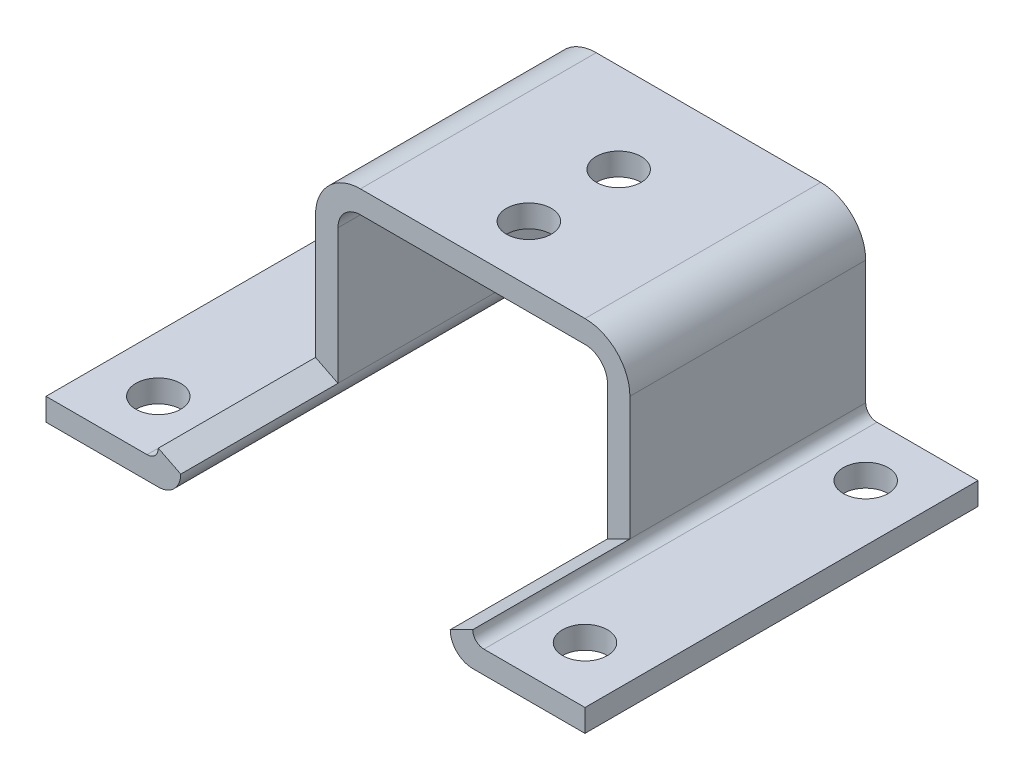
ISO-10303-21;
HEADER;
FILE_DESCRIPTION(('STEP AP214'),'2;1');
FILE_NAME('part.step','',(''),(''),'','','');
FILE_SCHEMA(('AUTOMOTIVE_DESIGN { 1 0 10303 214 1 1 1 1 }'));
ENDSEC;
DATA;
#1=APPLICATION_CONTEXT('core data for automotive mechanical design processes');
#2=APPLICATION_PROTOCOL_DEFINITION('international standard','automotive_design',2000,#1);
#3=PRODUCT_CONTEXT('',#1,'mechanical');
#4=PRODUCT('Part','Part','',(#3));
#5=PRODUCT_RELATED_PRODUCT_CATEGORY('part','',(#4));
#6=PRODUCT_DEFINITION_FORMATION('','',#4);
#7=PRODUCT_DEFINITION_CONTEXT('part definition',#1,'design');
#8=PRODUCT_DEFINITION('design','',#6,#7);
#9=PRODUCT_DEFINITION_SHAPE('','',#8);
#10=(LENGTH_UNIT() NAMED_UNIT(*) SI_UNIT(.MILLI.,.METRE.));
#11=(NAMED_UNIT(*) PLANE_ANGLE_UNIT() SI_UNIT($,.RADIAN.));
#12=(NAMED_UNIT(*) SI_UNIT($,.STERADIAN.) SOLID_ANGLE_UNIT());
#13=UNCERTAINTY_MEASURE_WITH_UNIT(LENGTH_MEASURE(1.E-05),#10,'distance_accuracy_value','');
#14=(GEOMETRIC_REPRESENTATION_CONTEXT(3) GLOBAL_UNCERTAINTY_ASSIGNED_CONTEXT((#13)) GLOBAL_UNIT_ASSIGNED_CONTEXT((#10,
#11,#12)) REPRESENTATION_CONTEXT('',''));
#15=CARTESIAN_POINT('',(0.,0.,0.));
#16=DIRECTION('',(0.,0.,1.));
#17=DIRECTION('',(1.,0.,0.));
#18=AXIS2_PLACEMENT_3D('',#15,#16,#17);
#19=CARTESIAN_POINT('',(-14.,2.,21.));
#20=DIRECTION('',(0.,0.,1.));
#21=DIRECTION('',(1.,0.,0.));
#22=AXIS2_PLACEMENT_3D('',#19,#20,#21);
#23=PLANE('',#22);
#24=DIRECTION('',(0.,-1.,0.));
#25=VECTOR('',#24,1.);
#26=CARTESIAN_POINT('',(12.,2.00000000000002,21.));
#27=LINE('',#26,#25);
#28=CARTESIAN_POINT('',(12.,14.,21.));
#29=VERTEX_POINT('',#28);
#30=CARTESIAN_POINT('',(12.,2.00000000000002,21.));
#31=VERTEX_POINT('',#30);
#32=EDGE_CURVE('E353',#29,#31,#27,.T.);
#33=ORIENTED_EDGE('',*,*,#32,.T.);
#34=DIRECTION('',(-0.894427190999918,-0.447213595499953,0.));
#35=VECTOR('',#34,1.);
#36=CARTESIAN_POINT('',(12.,2.00000000000002,21.));
#37=LINE('',#36,#35);
#38=CARTESIAN_POINT('',(14.,3.00000000000001,21.));
#39=VERTEX_POINT('',#38);
#40=EDGE_CURVE('E303',#39,#31,#37,.T.);
#41=ORIENTED_EDGE('',*,*,#40,.F.);
#42=DIRECTION('',(0.,1.,0.));
#43=VECTOR('',#42,1.);
#44=CARTESIAN_POINT('',(14.,3.00000000000001,21.));
#45=LINE('',#44,#43);
#46=CARTESIAN_POINT('',(14.,14.,21.));
#47=VERTEX_POINT('',#46);
#48=EDGE_CURVE('E167',#39,#47,#45,.T.);
#49=ORIENTED_EDGE('',*,*,#48,.T.);
#50=CARTESIAN_POINT('',(10.,14.,21.));
#51=DIRECTION('',(0.,0.,1.));
#52=DIRECTION('',(1.,0.,0.));
#53=AXIS2_PLACEMENT_3D('',#50,#51,#52);
#54=CIRCLE('',#53,4.);
#55=CARTESIAN_POINT('',(9.99999999999996,18.,21.));
#56=VERTEX_POINT('',#55);
#57=EDGE_CURVE('E159',#47,#56,#54,.T.);
#58=ORIENTED_EDGE('',*,*,#57,.T.);
#59=DIRECTION('',(-1.,0.,0.));
#60=VECTOR('',#59,1.);
#61=CARTESIAN_POINT('',(9.99999999999996,18.,21.));
#62=LINE('',#61,#60);
#63=CARTESIAN_POINT('',(-9.99999999999997,18.,21.));
#64=VERTEX_POINT('',#63);
#65=EDGE_CURVE('E163',#56,#64,#62,.T.);
#66=ORIENTED_EDGE('',*,*,#65,.T.);
#67=CARTESIAN_POINT('',(-10.,14.,21.));
#68=DIRECTION('',(0.,0.,1.));
#69=DIRECTION('',(-1.,0.,0.));
#70=AXIS2_PLACEMENT_3D('',#67,#68,#69);
#71=CIRCLE('',#70,4.);
#72=CARTESIAN_POINT('',(-14.,14.,21.));
#73=VERTEX_POINT('',#72);
#74=EDGE_CURVE('E56',#64,#73,#71,.T.);
#75=ORIENTED_EDGE('',*,*,#74,.T.);
#76=DIRECTION('',(0.,-1.,0.));
#77=VECTOR('',#76,1.);
#78=CARTESIAN_POINT('',(-14.,3.00000000000001,21.));
#79=LINE('',#78,#77);
#80=CARTESIAN_POINT('',(-14.,3.00000000000001,21.));
#81=VERTEX_POINT('',#80);
#82=EDGE_CURVE('E185',#73,#81,#79,.T.);
#83=ORIENTED_EDGE('',*,*,#82,.T.);
#84=DIRECTION('',(-0.894427190999916,0.447213595499958,0.));
#85=VECTOR('',#84,1.);
#86=CARTESIAN_POINT('',(-14.,3.00000000000001,21.));
#87=LINE('',#86,#85);
#88=CARTESIAN_POINT('',(-12.,2.,21.));
#89=VERTEX_POINT('',#88);
#90=EDGE_CURVE('E136',#89,#81,#87,.T.);
#91=ORIENTED_EDGE('',*,*,#90,.F.);
#92=DIRECTION('',(0.,1.,0.));
#93=VECTOR('',#92,1.);
#94=CARTESIAN_POINT('',(-12.,2.00000000000001,21.));
#95=LINE('',#94,#93);
#96=CARTESIAN_POINT('',(-12.,14.,21.));
#97=VERTEX_POINT('',#96);
#98=EDGE_CURVE('E231',#89,#97,#95,.T.);
#99=ORIENTED_EDGE('',*,*,#98,.T.);
#100=CARTESIAN_POINT('',(-10.,14.,21.));
#101=DIRECTION('',(0.,0.,-1.));
#102=DIRECTION('',(-1.,0.,0.));
#103=AXIS2_PLACEMENT_3D('',#100,#101,#102);
#104=CIRCLE('',#103,2.);
#105=CARTESIAN_POINT('',(-9.99999999999998,16.,21.));
#106=VERTEX_POINT('',#105);
#107=EDGE_CURVE('E347',#97,#106,#104,.T.);
#108=ORIENTED_EDGE('',*,*,#107,.T.);
#109=DIRECTION('',(1.,0.,0.));
#110=VECTOR('',#109,1.);
#111=CARTESIAN_POINT('',(-9.99999999999998,16.,21.));
#112=LINE('',#111,#110);
#113=CARTESIAN_POINT('',(9.99999999999998,16.,21.));
#114=VERTEX_POINT('',#113);
#115=EDGE_CURVE('E349',#106,#114,#112,.T.);
#116=ORIENTED_EDGE('',*,*,#115,.T.);
#117=CARTESIAN_POINT('',(10.,14.,21.));
#118=DIRECTION('',(0.,0.,-1.));
#119=DIRECTION('',(1.,0.,0.));
#120=AXIS2_PLACEMENT_3D('',#117,#118,#119);
#121=CIRCLE('',#120,2.);
#122=EDGE_CURVE('E351',#114,#29,#121,.T.);
#123=ORIENTED_EDGE('',*,*,#122,.T.);
#124=EDGE_LOOP('',(#33,#41,#49,#58,#66,#75,#83,#91,#99,#108,#116,#123));
#125=FACE_BOUND('',#124,.T.);
#126=ADVANCED_FACE('F37',(#125),#23,.T.);
#127=CARTESIAN_POINT('',(-24.,2.,21.));
#128=DIRECTION('',(1.,0.,0.));
#129=DIRECTION('',(0.,0.,-1.));
#130=AXIS2_PLACEMENT_3D('',#127,#128,#129);
#131=PLANE('',#130);
#132=DIRECTION('',(0.,-1.,0.));
#133=VECTOR('',#132,1.);
#134=CARTESIAN_POINT('',(-24.,2.,0.));
#135=LINE('',#134,#133);
#136=CARTESIAN_POINT('',(-24.,2.,0.));
#137=VERTEX_POINT('',#136);
#138=CARTESIAN_POINT('',(-24.,0.,0.));
#139=VERTEX_POINT('',#138);
#140=EDGE_CURVE('E191',#137,#139,#135,.T.);
#141=ORIENTED_EDGE('',*,*,#140,.T.);
#142=DIRECTION('',(0.,0.,-1.));
#143=VECTOR('',#142,1.);
#144=CARTESIAN_POINT('',(-24.,0.,21.));
#145=LINE('',#144,#143);
#146=CARTESIAN_POINT('',(-24.,0.,35.));
#147=VERTEX_POINT('',#146);
#148=EDGE_CURVE('E11',#147,#139,#145,.T.);
#149=ORIENTED_EDGE('',*,*,#148,.F.);
#150=DIRECTION('',(0.,-1.,0.));
#151=VECTOR('',#150,1.);
#152=CARTESIAN_POINT('',(-24.,2.,35.));
#153=LINE('',#152,#151);
#154=CARTESIAN_POINT('',(-24.,2.,35.));
#155=VERTEX_POINT('',#154);
#156=EDGE_CURVE('E325',#155,#147,#153,.T.);
#157=ORIENTED_EDGE('',*,*,#156,.F.);
#158=DIRECTION('',(0.,0.,-1.));
#159=VECTOR('',#158,1.);
#160=CARTESIAN_POINT('',(-24.,2.,21.));
#161=LINE('',#160,#159);
#162=EDGE_CURVE('E190',#155,#137,#161,.T.);
#163=ORIENTED_EDGE('',*,*,#162,.T.);
#164=EDGE_LOOP('',(#141,#149,#157,#163));
#165=FACE_BOUND('',#164,.T.);
#166=ADVANCED_FACE('F39',(#165),#131,.F.);
#167=CARTESIAN_POINT('',(-24.,0.,21.));
#168=DIRECTION('',(0.,1.,0.));
#169=DIRECTION('',(0.,0.,1.));
#170=AXIS2_PLACEMENT_3D('',#167,#168,#169);
#171=PLANE('',#170);
#172=CARTESIAN_POINT('',(-19.,0.,30.));
#173=DIRECTION('',(0.,1.,0.));
#174=DIRECTION('',(0.,0.,1.));
#175=AXIS2_PLACEMENT_3D('',#172,#173,#174);
#176=CIRCLE('',#175,2.);
#177=CARTESIAN_POINT('',(-19.,0.,32.));
#178=VERTEX_POINT('',#177);
#179=EDGE_CURVE('E854',#178,#178,#176,.T.);
#180=ORIENTED_EDGE('',*,*,#179,.T.);
#181=EDGE_LOOP('',(#180));
#182=FACE_BOUND('',#181,.T.);
#183=CARTESIAN_POINT('',(-19.,0.,5.));
#184=DIRECTION('',(0.,1.,0.));
#185=DIRECTION('',(0.,0.,1.));
#186=AXIS2_PLACEMENT_3D('',#183,#184,#185);
#187=CIRCLE('',#186,2.);
#188=CARTESIAN_POINT('',(-19.,0.,7.));
#189=VERTEX_POINT('',#188);
#190=EDGE_CURVE('E281',#189,#189,#187,.T.);
#191=ORIENTED_EDGE('',*,*,#190,.T.);
#192=EDGE_LOOP('',(#191));
#193=FACE_BOUND('',#192,.T.);
#194=DIRECTION('',(1.,0.,0.));
#195=VECTOR('',#194,1.);
#196=CARTESIAN_POINT('',(-24.,0.,0.));
#197=LINE('',#196,#195);
#198=CARTESIAN_POINT('',(-14.,0.,0.));
#199=VERTEX_POINT('',#198);
#200=EDGE_CURVE('E194',#139,#199,#197,.T.);
#201=ORIENTED_EDGE('',*,*,#200,.T.);
#202=DIRECTION('',(0.,0.,-1.));
#203=VECTOR('',#202,1.);
#204=CARTESIAN_POINT('',(-14.,0.,21.));
#205=LINE('',#204,#203);
#206=CARTESIAN_POINT('',(-14.,0.,35.));
#207=VERTEX_POINT('',#206);
#208=EDGE_CURVE('E47',#207,#199,#205,.T.);
#209=ORIENTED_EDGE('',*,*,#208,.F.);
#210=DIRECTION('',(1.,0.,0.));
#211=VECTOR('',#210,1.);
#212=CARTESIAN_POINT('',(-24.,0.,35.));
#213=LINE('',#212,#211);
#214=EDGE_CURVE('E328',#147,#207,#213,.T.);
#215=ORIENTED_EDGE('',*,*,#214,.F.);
#216=ORIENTED_EDGE('',*,*,#148,.T.);
#217=EDGE_LOOP('',(#201,#209,#215,#216));
#218=FACE_BOUND('',#217,.T.);
#219=ADVANCED_FACE('F436',(#182,#193,#218),#171,.F.);
#220=CARTESIAN_POINT('',(-14.,2.,21.));
#221=DIRECTION('',(0.,0.,-1.));
#222=DIRECTION('',(-1.,0.,0.));
#223=AXIS2_PLACEMENT_3D('',#220,#221,#222);
#224=CYLINDRICAL_SURFACE('',#223,2.);
#225=CARTESIAN_POINT('',(-14.,2.,0.));
#226=DIRECTION('',(0.,0.,1.));
#227=DIRECTION('',(1.,0.,0.));
#228=AXIS2_PLACEMENT_3D('',#225,#226,#227);
#229=CIRCLE('',#228,2.);
#230=CARTESIAN_POINT('',(-12.,2.,0.));
#231=VERTEX_POINT('',#230);
#232=EDGE_CURVE('E197',#199,#231,#229,.T.);
#233=ORIENTED_EDGE('',*,*,#232,.T.);
#234=DIRECTION('',(0.,0.,-1.));
#235=VECTOR('',#234,1.);
#236=CARTESIAN_POINT('',(-12.,2.,21.));
#237=LINE('',#236,#235);
#238=EDGE_CURVE('E272',#89,#231,#237,.T.);
#239=ORIENTED_EDGE('',*,*,#238,.F.);
#240=DIRECTION('',(0.,0.,-1.));
#241=VECTOR('',#240,1.);
#242=CARTESIAN_POINT('',(-12.,2.,35.));
#243=LINE('',#242,#241);
#244=CARTESIAN_POINT('',(-12.,2.,35.));
#245=VERTEX_POINT('',#244);
#246=EDGE_CURVE('E195',#245,#89,#243,.T.);
#247=ORIENTED_EDGE('',*,*,#246,.F.);
#248=CARTESIAN_POINT('',(-14.,2.,35.));
#249=DIRECTION('',(0.,0.,1.));
#250=DIRECTION('',(1.,0.,0.));
#251=AXIS2_PLACEMENT_3D('',#248,#249,#250);
#252=CIRCLE('',#251,2.);
#253=EDGE_CURVE('E331',#207,#245,#252,.T.);
#254=ORIENTED_EDGE('',*,*,#253,.F.);
#255=ORIENTED_EDGE('',*,*,#208,.T.);
#256=EDGE_LOOP('',(#233,#239,#247,#254,#255));
#257=FACE_BOUND('',#256,.T.);
#258=ADVANCED_FACE('F439',(#257),#224,.T.);
#259=CARTESIAN_POINT('',(-12.,2.00000000000001,21.));
#260=DIRECTION('',(-1.,0.,0.));
#261=DIRECTION('',(0.,0.,1.));
#262=AXIS2_PLACEMENT_3D('',#259,#260,#261);
#263=PLANE('',#262);
#264=DIRECTION('',(0.,1.,0.));
#265=VECTOR('',#264,1.);
#266=CARTESIAN_POINT('',(-12.,2.00000000000001,0.));
#267=LINE('',#266,#265);
#268=CARTESIAN_POINT('',(-12.,14.,0.));
#269=VERTEX_POINT('',#268);
#270=EDGE_CURVE('E199',#231,#269,#267,.T.);
#271=ORIENTED_EDGE('',*,*,#270,.T.);
#272=DIRECTION('',(0.,0.,-1.));
#273=VECTOR('',#272,1.);
#274=CARTESIAN_POINT('',(-12.,14.,21.));
#275=LINE('',#274,#273);
#276=EDGE_CURVE('E269',#97,#269,#275,.T.);
#277=ORIENTED_EDGE('',*,*,#276,.F.);
#278=ORIENTED_EDGE('',*,*,#98,.F.);
#279=ORIENTED_EDGE('',*,*,#238,.T.);
#280=EDGE_LOOP('',(#271,#277,#278,#279));
#281=FACE_BOUND('',#280,.T.);
#282=ADVANCED_FACE('F445',(#281),#263,.F.);
#283=CARTESIAN_POINT('',(-10.,14.,21.));
#284=DIRECTION('',(0.,0.,-1.));
#285=DIRECTION('',(-1.,0.,0.));
#286=AXIS2_PLACEMENT_3D('',#283,#284,#285);
#287=CYLINDRICAL_SURFACE('',#286,2.);
#288=CARTESIAN_POINT('',(-10.,14.,0.));
#289=DIRECTION('',(0.,0.,-1.));
#290=DIRECTION('',(-1.,0.,0.));
#291=AXIS2_PLACEMENT_3D('',#288,#289,#290);
#292=CIRCLE('',#291,2.);
#293=CARTESIAN_POINT('',(-9.99999999999998,16.,0.));
#294=VERTEX_POINT('',#293);
#295=EDGE_CURVE('E201',#269,#294,#292,.T.);
#296=ORIENTED_EDGE('',*,*,#295,.T.);
#297=DIRECTION('',(0.,0.,-1.));
#298=VECTOR('',#297,1.);
#299=CARTESIAN_POINT('',(-9.99999999999998,16.,21.));
#300=LINE('',#299,#298);
#301=EDGE_CURVE('E266',#106,#294,#300,.T.);
#302=ORIENTED_EDGE('',*,*,#301,.F.);
#303=ORIENTED_EDGE('',*,*,#107,.F.);
#304=ORIENTED_EDGE('',*,*,#276,.T.);
#305=EDGE_LOOP('',(#296,#302,#303,#304));
#306=FACE_BOUND('',#305,.T.);
#307=ADVANCED_FACE('F449',(#306),#287,.F.);
#308=CARTESIAN_POINT('',(9.99999999999998,16.,21.));
#309=DIRECTION('',(0.,1.,0.));
#310=DIRECTION('',(-1.,0.,0.));
#311=AXIS2_PLACEMENT_3D('',#308,#309,#310);
#312=PLANE('',#311);
#313=CARTESIAN_POINT('',(0.,16.,8.));
#314=DIRECTION('',(0.,1.,0.));
#315=DIRECTION('',(-1.,0.,0.));
#316=AXIS2_PLACEMENT_3D('',#313,#314,#315);
#317=CIRCLE('',#316,2.);
#318=CARTESIAN_POINT('',(-2.,16.,8.));
#319=VERTEX_POINT('',#318);
#320=EDGE_CURVE('E839',#319,#319,#317,.T.);
#321=ORIENTED_EDGE('',*,*,#320,.T.);
#322=EDGE_LOOP('',(#321));
#323=FACE_BOUND('',#322,.T.);
#324=CARTESIAN_POINT('',(0.,16.,16.));
#325=DIRECTION('',(0.,1.,0.));
#326=DIRECTION('',(-1.,0.,0.));
#327=AXIS2_PLACEMENT_3D('',#324,#325,#326);
#328=CIRCLE('',#327,2.);
#329=CARTESIAN_POINT('',(-2.,16.,16.));
#330=VERTEX_POINT('',#329);
#331=EDGE_CURVE('E843',#330,#330,#328,.T.);
#332=ORIENTED_EDGE('',*,*,#331,.T.);
#333=EDGE_LOOP('',(#332));
#334=FACE_BOUND('',#333,.T.);
#335=DIRECTION('',(1.,0.,0.));
#336=VECTOR('',#335,1.);
#337=CARTESIAN_POINT('',(9.99999999999998,16.,0.));
#338=LINE('',#337,#336);
#339=CARTESIAN_POINT('',(9.99999999999998,16.,0.));
#340=VERTEX_POINT('',#339);
#341=EDGE_CURVE('E204',#294,#340,#338,.T.);
#342=ORIENTED_EDGE('',*,*,#341,.T.);
#343=DIRECTION('',(0.,0.,-1.));
#344=VECTOR('',#343,1.);
#345=CARTESIAN_POINT('',(9.99999999999998,16.,21.));
#346=LINE('',#345,#344);
#347=EDGE_CURVE('E263',#114,#340,#346,.T.);
#348=ORIENTED_EDGE('',*,*,#347,.F.);
#349=ORIENTED_EDGE('',*,*,#115,.F.);
#350=ORIENTED_EDGE('',*,*,#301,.T.);
#351=EDGE_LOOP('',(#342,#348,#349,#350));
#352=FACE_BOUND('',#351,.T.);
#353=ADVANCED_FACE('F775',(#323,#334,#352),#312,.F.);
#354=CARTESIAN_POINT('',(10.,14.,21.));
#355=DIRECTION('',(0.,0.,-1.));
#356=DIRECTION('',(-1.,0.,0.));
#357=AXIS2_PLACEMENT_3D('',#354,#355,#356);
#358=CYLINDRICAL_SURFACE('',#357,2.);
#359=CARTESIAN_POINT('',(10.,14.,0.));
#360=DIRECTION('',(0.,0.,-1.));
#361=DIRECTION('',(1.,0.,0.));
#362=AXIS2_PLACEMENT_3D('',#359,#360,#361);
#363=CIRCLE('',#362,2.);
#364=CARTESIAN_POINT('',(12.,14.,0.));
#365=VERTEX_POINT('',#364);
#366=EDGE_CURVE('E206',#340,#365,#363,.T.);
#367=ORIENTED_EDGE('',*,*,#366,.T.);
#368=DIRECTION('',(0.,0.,-1.));
#369=VECTOR('',#368,1.);
#370=CARTESIAN_POINT('',(12.,14.,21.));
#371=LINE('',#370,#369);
#372=EDGE_CURVE('E260',#29,#365,#371,.T.);
#373=ORIENTED_EDGE('',*,*,#372,.F.);
#374=ORIENTED_EDGE('',*,*,#122,.F.);
#375=ORIENTED_EDGE('',*,*,#347,.T.);
#376=EDGE_LOOP('',(#367,#373,#374,#375));
#377=FACE_BOUND('',#376,.T.);
#378=ADVANCED_FACE('F767',(#377),#358,.F.);
#379=CARTESIAN_POINT('',(12.,2.00000000000002,21.));
#380=DIRECTION('',(1.,0.,0.));
#381=DIRECTION('',(0.,1.,0.));
#382=AXIS2_PLACEMENT_3D('',#379,#380,#381);
#383=PLANE('',#382);
#384=DIRECTION('',(0.,-1.,0.));
#385=VECTOR('',#384,1.);
#386=CARTESIAN_POINT('',(12.,2.00000000000002,0.));
#387=LINE('',#386,#385);
#388=CARTESIAN_POINT('',(12.,2.00000000000002,0.));
#389=VERTEX_POINT('',#388);
#390=EDGE_CURVE('E208',#365,#389,#387,.T.);
#391=ORIENTED_EDGE('',*,*,#390,.T.);
#392=DIRECTION('',(0.,0.,-1.));
#393=VECTOR('',#392,1.);
#394=CARTESIAN_POINT('',(12.,2.00000000000002,21.));
#395=LINE('',#394,#393);
#396=EDGE_CURVE('E257',#31,#389,#395,.T.);
#397=ORIENTED_EDGE('',*,*,#396,.F.);
#398=ORIENTED_EDGE('',*,*,#32,.F.);
#399=ORIENTED_EDGE('',*,*,#372,.T.);
#400=EDGE_LOOP('',(#391,#397,#398,#399));
#401=FACE_BOUND('',#400,.T.);
#402=ADVANCED_FACE('F363',(#401),#383,.F.);
#403=CARTESIAN_POINT('',(14.,2.,21.));
#404=DIRECTION('',(0.,0.,-1.));
#405=DIRECTION('',(-1.,0.,0.));
#406=AXIS2_PLACEMENT_3D('',#403,#404,#405);
#407=CYLINDRICAL_SURFACE('',#406,2.);
#408=CARTESIAN_POINT('',(14.,2.,0.));
#409=DIRECTION('',(0.,0.,1.));
#410=DIRECTION('',(-1.,0.,0.));
#411=AXIS2_PLACEMENT_3D('',#408,#409,#410);
#412=CIRCLE('',#411,2.);
#413=CARTESIAN_POINT('',(14.,0.,0.));
#414=VERTEX_POINT('',#413);
#415=EDGE_CURVE('E210',#389,#414,#412,.T.);
#416=ORIENTED_EDGE('',*,*,#415,.T.);
#417=DIRECTION('',(0.,0.,-1.));
#418=VECTOR('',#417,1.);
#419=CARTESIAN_POINT('',(14.,0.,21.));
#420=LINE('',#419,#418);
#421=CARTESIAN_POINT('',(14.,0.,35.));
#422=VERTEX_POINT('',#421);
#423=EDGE_CURVE('E254',#422,#414,#420,.T.);
#424=ORIENTED_EDGE('',*,*,#423,.F.);
#425=CARTESIAN_POINT('',(14.,2.,35.));
#426=DIRECTION('',(0.,0.,1.));
#427=DIRECTION('',(1.,0.,0.));
#428=AXIS2_PLACEMENT_3D('',#425,#426,#427);
#429=CIRCLE('',#428,2.);
#430=CARTESIAN_POINT('',(12.,2.00000000000002,35.));
#431=VERTEX_POINT('',#430);
#432=EDGE_CURVE('E305',#431,#422,#429,.T.);
#433=ORIENTED_EDGE('',*,*,#432,.F.);
#434=DIRECTION('',(0.,0.,-1.));
#435=VECTOR('',#434,1.);
#436=CARTESIAN_POINT('',(12.,2.00000000000002,35.));
#437=LINE('',#436,#435);
#438=EDGE_CURVE('E291',#431,#31,#437,.T.);
#439=ORIENTED_EDGE('',*,*,#438,.T.);
#440=ORIENTED_EDGE('',*,*,#396,.T.);
#441=EDGE_LOOP('',(#416,#424,#433,#439,#440));
#442=FACE_BOUND('',#441,.T.);
#443=ADVANCED_FACE('F367',(#442),#407,.T.);
#444=CARTESIAN_POINT('',(24.,0.,21.));
#445=DIRECTION('',(0.,1.,0.));
#446=DIRECTION('',(-1.,0.,0.));
#447=AXIS2_PLACEMENT_3D('',#444,#445,#446);
#448=PLANE('',#447);
#449=CARTESIAN_POINT('',(19.,0.,4.99999999999999));
#450=DIRECTION('',(0.,-1.,0.));
#451=DIRECTION('',(0.,0.,-1.));
#452=AXIS2_PLACEMENT_3D('',#449,#450,#451);
#453=CIRCLE('',#452,2.);
#454=CARTESIAN_POINT('',(19.,0.,2.99999999999999));
#455=VERTEX_POINT('',#454);
#456=EDGE_CURVE('E847',#455,#455,#453,.T.);
#457=ORIENTED_EDGE('',*,*,#456,.F.);
#458=EDGE_LOOP('',(#457));
#459=FACE_BOUND('',#458,.T.);
#460=CARTESIAN_POINT('',(19.,0.,30.));
#461=DIRECTION('',(0.,-1.,0.));
#462=DIRECTION('',(0.,0.,-1.));
#463=AXIS2_PLACEMENT_3D('',#460,#461,#462);
#464=CIRCLE('',#463,2.);
#465=CARTESIAN_POINT('',(19.,0.,28.));
#466=VERTEX_POINT('',#465);
#467=EDGE_CURVE('E857',#466,#466,#464,.T.);
#468=ORIENTED_EDGE('',*,*,#467,.F.);
#469=EDGE_LOOP('',(#468));
#470=FACE_BOUND('',#469,.T.);
#471=DIRECTION('',(1.,0.,0.));
#472=VECTOR('',#471,1.);
#473=CARTESIAN_POINT('',(24.,0.,0.));
#474=LINE('',#473,#472);
#475=CARTESIAN_POINT('',(24.,0.,0.));
#476=VERTEX_POINT('',#475);
#477=EDGE_CURVE('E212',#414,#476,#474,.T.);
#478=ORIENTED_EDGE('',*,*,#477,.T.);
#479=DIRECTION('',(0.,0.,-1.));
#480=VECTOR('',#479,1.);
#481=CARTESIAN_POINT('',(24.,0.,21.));
#482=LINE('',#481,#480);
#483=CARTESIAN_POINT('',(24.,0.,35.));
#484=VERTEX_POINT('',#483);
#485=EDGE_CURVE('E251',#484,#476,#482,.T.);
#486=ORIENTED_EDGE('',*,*,#485,.F.);
#487=DIRECTION('',(1.,0.,0.));
#488=VECTOR('',#487,1.);
#489=CARTESIAN_POINT('',(14.,0.,35.));
#490=LINE('',#489,#488);
#491=EDGE_CURVE('E317',#422,#484,#490,.T.);
#492=ORIENTED_EDGE('',*,*,#491,.F.);
#493=ORIENTED_EDGE('',*,*,#423,.T.);
#494=EDGE_LOOP('',(#478,#486,#492,#493));
#495=FACE_BOUND('',#494,.T.);
#496=ADVANCED_FACE('F380',(#459,#470,#495),#448,.F.);
#497=CARTESIAN_POINT('',(24.,2.00000000000001,21.));
#498=DIRECTION('',(-1.,0.,0.));
#499=DIRECTION('',(0.,0.,1.));
#500=AXIS2_PLACEMENT_3D('',#497,#498,#499);
#501=PLANE('',#500);
#502=DIRECTION('',(0.,1.,0.));
#503=VECTOR('',#502,1.);
#504=CARTESIAN_POINT('',(24.,2.00000000000001,0.));
#505=LINE('',#504,#503);
#506=CARTESIAN_POINT('',(24.,2.00000000000001,0.));
#507=VERTEX_POINT('',#506);
#508=EDGE_CURVE('E214',#476,#507,#505,.T.);
#509=ORIENTED_EDGE('',*,*,#508,.T.);
#510=DIRECTION('',(0.,0.,-1.));
#511=VECTOR('',#510,1.);
#512=CARTESIAN_POINT('',(24.,2.00000000000001,21.));
#513=LINE('',#512,#511);
#514=CARTESIAN_POINT('',(24.,2.00000000000001,35.));
#515=VERTEX_POINT('',#514);
#516=EDGE_CURVE('E248',#515,#507,#513,.T.);
#517=ORIENTED_EDGE('',*,*,#516,.F.);
#518=DIRECTION('',(0.,1.,0.));
#519=VECTOR('',#518,1.);
#520=CARTESIAN_POINT('',(24.,0.,35.));
#521=LINE('',#520,#519);
#522=EDGE_CURVE('E314',#484,#515,#521,.T.);
#523=ORIENTED_EDGE('',*,*,#522,.F.);
#524=ORIENTED_EDGE('',*,*,#485,.T.);
#525=EDGE_LOOP('',(#509,#517,#523,#524));
#526=FACE_BOUND('',#525,.T.);
#527=ADVANCED_FACE('F385',(#526),#501,.F.);
#528=CARTESIAN_POINT('',(24.,2.00000000000001,21.));
#529=DIRECTION('',(0.,-1.,0.));
#530=DIRECTION('',(1.,0.,0.));
#531=AXIS2_PLACEMENT_3D('',#528,#529,#530);
#532=PLANE('',#531);
#533=CARTESIAN_POINT('',(19.,2.00000000000001,4.99999999999999));
#534=DIRECTION('',(0.,-1.,0.));
#535=DIRECTION('',(1.,0.,0.));
#536=AXIS2_PLACEMENT_3D('',#533,#534,#535);
#537=CIRCLE('',#536,2.);
#538=CARTESIAN_POINT('',(21.,2.00000000000001,4.99999999999999));
#539=VERTEX_POINT('',#538);
#540=EDGE_CURVE('E41',#539,#539,#537,.T.);
#541=ORIENTED_EDGE('',*,*,#540,.T.);
#542=EDGE_LOOP('',(#541));
#543=FACE_BOUND('',#542,.T.);
#544=CARTESIAN_POINT('',(19.,2.00000000000001,30.));
#545=DIRECTION('',(0.,-1.,0.));
#546=DIRECTION('',(1.,0.,0.));
#547=AXIS2_PLACEMENT_3D('',#544,#545,#546);
#548=CIRCLE('',#547,2.);
#549=CARTESIAN_POINT('',(21.,2.00000000000001,30.));
#550=VERTEX_POINT('',#549);
#551=EDGE_CURVE('E283',#550,#550,#548,.T.);
#552=ORIENTED_EDGE('',*,*,#551,.T.);
#553=EDGE_LOOP('',(#552));
#554=FACE_BOUND('',#553,.T.);
#555=DIRECTION('',(-1.,0.,0.));
#556=VECTOR('',#555,1.);
#557=CARTESIAN_POINT('',(24.,2.00000000000001,0.));
#558=LINE('',#557,#556);
#559=CARTESIAN_POINT('',(15.,2.00000000000001,0.));
#560=VERTEX_POINT('',#559);
#561=EDGE_CURVE('E216',#507,#560,#558,.T.);
#562=ORIENTED_EDGE('',*,*,#561,.T.);
#563=DIRECTION('',(0.,0.,-1.));
#564=VECTOR('',#563,1.);
#565=CARTESIAN_POINT('',(15.,2.00000000000001,21.));
#566=LINE('',#565,#564);
#567=CARTESIAN_POINT('',(15.,2.,35.));
#568=VERTEX_POINT('',#567);
#569=EDGE_CURVE('E245',#568,#560,#566,.T.);
#570=ORIENTED_EDGE('',*,*,#569,.F.);
#571=DIRECTION('',(-1.,0.,0.));
#572=VECTOR('',#571,1.);
#573=CARTESIAN_POINT('',(24.,2.00000000000001,35.));
#574=LINE('',#573,#572);
#575=EDGE_CURVE('E311',#515,#568,#574,.T.);
#576=ORIENTED_EDGE('',*,*,#575,.F.);
#577=ORIENTED_EDGE('',*,*,#516,.T.);
#578=EDGE_LOOP('',(#562,#570,#576,#577));
#579=FACE_BOUND('',#578,.T.);
#580=ADVANCED_FACE('F397',(#543,#554,#579),#532,.F.);
#581=CARTESIAN_POINT('',(15.,3.00000000000001,21.));
#582=DIRECTION('',(0.,0.,-1.));
#583=DIRECTION('',(-1.,0.,0.));
#584=AXIS2_PLACEMENT_3D('',#581,#582,#583);
#585=CYLINDRICAL_SURFACE('',#584,1.);
#586=CARTESIAN_POINT('',(15.,3.00000000000001,0.));
#587=DIRECTION('',(0.,0.,-1.));
#588=DIRECTION('',(1.,0.,0.));
#589=AXIS2_PLACEMENT_3D('',#586,#587,#588);
#590=CIRCLE('',#589,1.);
#591=CARTESIAN_POINT('',(14.,3.00000000000001,0.));
#592=VERTEX_POINT('',#591);
#593=EDGE_CURVE('E218',#560,#592,#590,.T.);
#594=ORIENTED_EDGE('',*,*,#593,.T.);
#595=DIRECTION('',(0.,0.,-1.));
#596=VECTOR('',#595,1.);
#597=CARTESIAN_POINT('',(14.,3.00000000000001,21.));
#598=LINE('',#597,#596);
#599=EDGE_CURVE('E242',#39,#592,#598,.T.);
#600=ORIENTED_EDGE('',*,*,#599,.F.);
#601=DIRECTION('',(0.,0.,-1.));
#602=VECTOR('',#601,1.);
#603=CARTESIAN_POINT('',(14.,3.00000000000001,35.));
#604=LINE('',#603,#602);
#605=CARTESIAN_POINT('',(14.,3.00000000000001,35.));
#606=VERTEX_POINT('',#605);
#607=EDGE_CURVE('E288',#606,#39,#604,.T.);
#608=ORIENTED_EDGE('',*,*,#607,.F.);
#609=CARTESIAN_POINT('',(15.,3.00000000000001,35.));
#610=DIRECTION('',(0.,0.,-1.));
#611=DIRECTION('',(1.,0.,0.));
#612=AXIS2_PLACEMENT_3D('',#609,#610,#611);
#613=CIRCLE('',#612,1.);
#614=EDGE_CURVE('E308',#568,#606,#613,.T.);
#615=ORIENTED_EDGE('',*,*,#614,.F.);
#616=ORIENTED_EDGE('',*,*,#569,.T.);
#617=EDGE_LOOP('',(#594,#600,#608,#615,#616));
#618=FACE_BOUND('',#617,.T.);
#619=ADVANCED_FACE('F402',(#618),#585,.F.);
#620=CARTESIAN_POINT('',(14.,3.00000000000001,21.));
#621=DIRECTION('',(-1.,0.,0.));
#622=DIRECTION('',(0.,-1.,0.));
#623=AXIS2_PLACEMENT_3D('',#620,#621,#622);
#624=PLANE('',#623);
#625=DIRECTION('',(0.,1.,0.));
#626=VECTOR('',#625,1.);
#627=CARTESIAN_POINT('',(14.,3.00000000000001,0.));
#628=LINE('',#627,#626);
#629=CARTESIAN_POINT('',(14.,14.,0.));
#630=VERTEX_POINT('',#629);
#631=EDGE_CURVE('E220',#592,#630,#628,.T.);
#632=ORIENTED_EDGE('',*,*,#631,.T.);
#633=DIRECTION('',(0.,0.,-1.));
#634=VECTOR('',#633,1.);
#635=CARTESIAN_POINT('',(14.,14.,21.));
#636=LINE('',#635,#634);
#637=EDGE_CURVE('E179',#47,#630,#636,.T.);
#638=ORIENTED_EDGE('',*,*,#637,.F.);
#639=ORIENTED_EDGE('',*,*,#48,.F.);
#640=ORIENTED_EDGE('',*,*,#599,.T.);
#641=EDGE_LOOP('',(#632,#638,#639,#640));
#642=FACE_BOUND('',#641,.T.);
#643=ADVANCED_FACE('F405',(#642),#624,.F.);
#644=CARTESIAN_POINT('',(10.,14.,21.));
#645=DIRECTION('',(0.,0.,-1.));
#646=DIRECTION('',(-1.,0.,0.));
#647=AXIS2_PLACEMENT_3D('',#644,#645,#646);
#648=CYLINDRICAL_SURFACE('',#647,4.);
#649=CARTESIAN_POINT('',(10.,14.,0.));
#650=DIRECTION('',(0.,0.,1.));
#651=DIRECTION('',(1.,0.,0.));
#652=AXIS2_PLACEMENT_3D('',#649,#650,#651);
#653=CIRCLE('',#652,4.);
#654=CARTESIAN_POINT('',(9.99999999999996,18.,0.));
#655=VERTEX_POINT('',#654);
#656=EDGE_CURVE('E177',#630,#655,#653,.T.);
#657=ORIENTED_EDGE('',*,*,#656,.T.);
#658=DIRECTION('',(0.,0.,-1.));
#659=VECTOR('',#658,1.);
#660=CARTESIAN_POINT('',(9.99999999999996,18.,21.));
#661=LINE('',#660,#659);
#662=EDGE_CURVE('E174',#56,#655,#661,.T.);
#663=ORIENTED_EDGE('',*,*,#662,.F.);
#664=ORIENTED_EDGE('',*,*,#57,.F.);
#665=ORIENTED_EDGE('',*,*,#637,.T.);
#666=EDGE_LOOP('',(#657,#663,#664,#665));
#667=FACE_BOUND('',#666,.T.);
#668=ADVANCED_FACE('F175',(#667),#648,.T.);
#669=CARTESIAN_POINT('',(-9.99999999999997,18.,21.));
#670=DIRECTION('',(0.,-1.,0.));
#671=DIRECTION('',(0.,0.,-1.));
#672=AXIS2_PLACEMENT_3D('',#669,#670,#671);
#673=PLANE('',#672);
#674=CARTESIAN_POINT('',(0.,18.,8.));
#675=DIRECTION('',(0.,1.,0.));
#676=DIRECTION('',(0.,0.,1.));
#677=AXIS2_PLACEMENT_3D('',#674,#675,#676);
#678=CIRCLE('',#677,2.);
#679=CARTESIAN_POINT('',(0.,18.,10.));
#680=VERTEX_POINT('',#679);
#681=EDGE_CURVE('E845',#680,#680,#678,.T.);
#682=ORIENTED_EDGE('',*,*,#681,.F.);
#683=EDGE_LOOP('',(#682));
#684=FACE_BOUND('',#683,.T.);
#685=CARTESIAN_POINT('',(0.,18.,16.));
#686=DIRECTION('',(0.,1.,0.));
#687=DIRECTION('',(0.,0.,1.));
#688=AXIS2_PLACEMENT_3D('',#685,#686,#687);
#689=CIRCLE('',#688,2.);
#690=CARTESIAN_POINT('',(0.,18.,18.));
#691=VERTEX_POINT('',#690);
#692=EDGE_CURVE('E850',#691,#691,#689,.T.);
#693=ORIENTED_EDGE('',*,*,#692,.F.);
#694=EDGE_LOOP('',(#693));
#695=FACE_BOUND('',#694,.T.);
#696=DIRECTION('',(-1.,0.,0.));
#697=VECTOR('',#696,1.);
#698=CARTESIAN_POINT('',(-9.99999999999997,18.,0.));
#699=LINE('',#698,#697);
#700=CARTESIAN_POINT('',(-9.99999999999997,18.,0.));
#701=VERTEX_POINT('',#700);
#702=EDGE_CURVE('E223',#655,#701,#699,.T.);
#703=ORIENTED_EDGE('',*,*,#702,.T.);
#704=DIRECTION('',(0.,0.,-1.));
#705=VECTOR('',#704,1.);
#706=CARTESIAN_POINT('',(-9.99999999999997,18.,21.));
#707=LINE('',#706,#705);
#708=EDGE_CURVE('E180',#64,#701,#707,.T.);
#709=ORIENTED_EDGE('',*,*,#708,.F.);
#710=ORIENTED_EDGE('',*,*,#65,.F.);
#711=ORIENTED_EDGE('',*,*,#662,.T.);
#712=EDGE_LOOP('',(#703,#709,#710,#711));
#713=FACE_BOUND('',#712,.T.);
#714=ADVANCED_FACE('F182',(#684,#695,#713),#673,.F.);
#715=CARTESIAN_POINT('',(-10.,14.,21.));
#716=DIRECTION('',(0.,0.,-1.));
#717=DIRECTION('',(-1.,0.,0.));
#718=AXIS2_PLACEMENT_3D('',#715,#716,#717);
#719=CYLINDRICAL_SURFACE('',#718,4.);
#720=CARTESIAN_POINT('',(-10.,14.,0.));
#721=DIRECTION('',(0.,0.,1.));
#722=DIRECTION('',(-1.,0.,0.));
#723=AXIS2_PLACEMENT_3D('',#720,#721,#722);
#724=CIRCLE('',#723,4.);
#725=CARTESIAN_POINT('',(-14.,14.,0.));
#726=VERTEX_POINT('',#725);
#727=EDGE_CURVE('E225',#701,#726,#724,.T.);
#728=ORIENTED_EDGE('',*,*,#727,.T.);
#729=DIRECTION('',(0.,0.,-1.));
#730=VECTOR('',#729,1.);
#731=CARTESIAN_POINT('',(-14.,14.,21.));
#732=LINE('',#731,#730);
#733=EDGE_CURVE('E237',#73,#726,#732,.T.);
#734=ORIENTED_EDGE('',*,*,#733,.F.);
#735=ORIENTED_EDGE('',*,*,#74,.F.);
#736=ORIENTED_EDGE('',*,*,#708,.T.);
#737=EDGE_LOOP('',(#728,#734,#735,#736));
#738=FACE_BOUND('',#737,.T.);
#739=ADVANCED_FACE('F462',(#738),#719,.T.);
#740=CARTESIAN_POINT('',(-14.,3.00000000000001,21.));
#741=DIRECTION('',(1.,0.,0.));
#742=DIRECTION('',(0.,1.,0.));
#743=AXIS2_PLACEMENT_3D('',#740,#741,#742);
#744=PLANE('',#743);
#745=DIRECTION('',(0.,-1.,0.));
#746=VECTOR('',#745,1.);
#747=CARTESIAN_POINT('',(-14.,3.00000000000001,0.));
#748=LINE('',#747,#746);
#749=CARTESIAN_POINT('',(-14.,3.00000000000001,0.));
#750=VERTEX_POINT('',#749);
#751=EDGE_CURVE('E227',#726,#750,#748,.T.);
#752=ORIENTED_EDGE('',*,*,#751,.T.);
#753=DIRECTION('',(0.,0.,-1.));
#754=VECTOR('',#753,1.);
#755=CARTESIAN_POINT('',(-14.,3.00000000000001,21.));
#756=LINE('',#755,#754);
#757=EDGE_CURVE('E235',#81,#750,#756,.T.);
#758=ORIENTED_EDGE('',*,*,#757,.F.);
#759=ORIENTED_EDGE('',*,*,#82,.F.);
#760=ORIENTED_EDGE('',*,*,#733,.T.);
#761=EDGE_LOOP('',(#752,#758,#759,#760));
#762=FACE_BOUND('',#761,.T.);
#763=ADVANCED_FACE('F458',(#762),#744,.F.);
#764=CARTESIAN_POINT('',(-15.,3.,21.));
#765=DIRECTION('',(0.,0.,-1.));
#766=DIRECTION('',(-1.,0.,0.));
#767=AXIS2_PLACEMENT_3D('',#764,#765,#766);
#768=CYLINDRICAL_SURFACE('',#767,1.);
#769=CARTESIAN_POINT('',(-15.,3.,0.));
#770=DIRECTION('',(0.,0.,-1.));
#771=DIRECTION('',(-1.,0.,0.));
#772=AXIS2_PLACEMENT_3D('',#769,#770,#771);
#773=CIRCLE('',#772,1.);
#774=CARTESIAN_POINT('',(-15.,2.,0.));
#775=VERTEX_POINT('',#774);
#776=EDGE_CURVE('E122',#750,#775,#773,.T.);
#777=ORIENTED_EDGE('',*,*,#776,.T.);
#778=DIRECTION('',(0.,0.,-1.));
#779=VECTOR('',#778,1.);
#780=CARTESIAN_POINT('',(-15.,2.,21.));
#781=LINE('',#780,#779);
#782=CARTESIAN_POINT('',(-15.,2.,35.));
#783=VERTEX_POINT('',#782);
#784=EDGE_CURVE('E233',#783,#775,#781,.T.);
#785=ORIENTED_EDGE('',*,*,#784,.F.);
#786=CARTESIAN_POINT('',(-15.,3.,35.));
#787=DIRECTION('',(0.,0.,-1.));
#788=DIRECTION('',(1.,0.,0.));
#789=AXIS2_PLACEMENT_3D('',#786,#787,#788);
#790=CIRCLE('',#789,1.);
#791=CARTESIAN_POINT('',(-14.,3.00000000000001,35.));
#792=VERTEX_POINT('',#791);
#793=EDGE_CURVE('E337',#792,#783,#790,.T.);
#794=ORIENTED_EDGE('',*,*,#793,.F.);
#795=DIRECTION('',(0.,0.,-1.));
#796=VECTOR('',#795,1.);
#797=CARTESIAN_POINT('',(-14.,3.00000000000001,35.));
#798=LINE('',#797,#796);
#799=EDGE_CURVE('E340',#792,#81,#798,.T.);
#800=ORIENTED_EDGE('',*,*,#799,.T.);
#801=ORIENTED_EDGE('',*,*,#757,.T.);
#802=EDGE_LOOP('',(#777,#785,#794,#800,#801));
#803=FACE_BOUND('',#802,.T.);
#804=ADVANCED_FACE('F424',(#803),#768,.F.);
#805=CARTESIAN_POINT('',(-24.,2.,21.));
#806=DIRECTION('',(0.,-1.,0.));
#807=DIRECTION('',(0.,0.,-1.));
#808=AXIS2_PLACEMENT_3D('',#805,#806,#807);
#809=PLANE('',#808);
#810=CARTESIAN_POINT('',(-19.,2.,30.));
#811=DIRECTION('',(0.,-1.,0.));
#812=DIRECTION('',(0.,0.,-1.));
#813=AXIS2_PLACEMENT_3D('',#810,#811,#812);
#814=CIRCLE('',#813,2.);
#815=CARTESIAN_POINT('',(-19.,2.,28.));
#816=VERTEX_POINT('',#815);
#817=EDGE_CURVE('E280',#816,#816,#814,.F.);
#818=ORIENTED_EDGE('',*,*,#817,.F.);
#819=EDGE_LOOP('',(#818));
#820=FACE_BOUND('',#819,.T.);
#821=CARTESIAN_POINT('',(-19.,2.,5.));
#822=DIRECTION('',(0.,-1.,0.));
#823=DIRECTION('',(0.,0.,-1.));
#824=AXIS2_PLACEMENT_3D('',#821,#822,#823);
#825=CIRCLE('',#824,2.);
#826=CARTESIAN_POINT('',(-19.,2.,2.99999999999999));
#827=VERTEX_POINT('',#826);
#828=EDGE_CURVE('E277',#827,#827,#825,.F.);
#829=ORIENTED_EDGE('',*,*,#828,.F.);
#830=EDGE_LOOP('',(#829));
#831=FACE_BOUND('',#830,.T.);
#832=DIRECTION('',(-1.,0.,0.));
#833=VECTOR('',#832,1.);
#834=CARTESIAN_POINT('',(-24.,2.,0.));
#835=LINE('',#834,#833);
#836=EDGE_CURVE('E129',#775,#137,#835,.T.);
#837=ORIENTED_EDGE('',*,*,#836,.T.);
#838=ORIENTED_EDGE('',*,*,#162,.F.);
#839=DIRECTION('',(-1.,0.,0.));
#840=VECTOR('',#839,1.);
#841=CARTESIAN_POINT('',(-15.,2.,35.));
#842=LINE('',#841,#840);
#843=EDGE_CURVE('E322',#783,#155,#842,.T.);
#844=ORIENTED_EDGE('',*,*,#843,.F.);
#845=ORIENTED_EDGE('',*,*,#784,.T.);
#846=EDGE_LOOP('',(#837,#838,#844,#845));
#847=FACE_BOUND('',#846,.T.);
#848=ADVANCED_FACE('F430',(#820,#831,#847),#809,.F.);
#849=CARTESIAN_POINT('',(-14.,2.,0.));
#850=DIRECTION('',(0.,0.,1.));
#851=DIRECTION('',(1.,0.,0.));
#852=AXIS2_PLACEMENT_3D('',#849,#850,#851);
#853=PLANE('',#852);
#854=ORIENTED_EDGE('',*,*,#140,.F.);
#855=ORIENTED_EDGE('',*,*,#836,.F.);
#856=ORIENTED_EDGE('',*,*,#776,.F.);
#857=ORIENTED_EDGE('',*,*,#751,.F.);
#858=ORIENTED_EDGE('',*,*,#727,.F.);
#859=ORIENTED_EDGE('',*,*,#702,.F.);
#860=ORIENTED_EDGE('',*,*,#656,.F.);
#861=ORIENTED_EDGE('',*,*,#631,.F.);
#862=ORIENTED_EDGE('',*,*,#593,.F.);
#863=ORIENTED_EDGE('',*,*,#561,.F.);
#864=ORIENTED_EDGE('',*,*,#508,.F.);
#865=ORIENTED_EDGE('',*,*,#477,.F.);
#866=ORIENTED_EDGE('',*,*,#415,.F.);
#867=ORIENTED_EDGE('',*,*,#390,.F.);
#868=ORIENTED_EDGE('',*,*,#366,.F.);
#869=ORIENTED_EDGE('',*,*,#341,.F.);
#870=ORIENTED_EDGE('',*,*,#295,.F.);
#871=ORIENTED_EDGE('',*,*,#270,.F.);
#872=ORIENTED_EDGE('',*,*,#232,.F.);
#873=ORIENTED_EDGE('',*,*,#200,.F.);
#874=EDGE_LOOP('',(#854,#855,#856,#857,#858,#859,#860,#861,#862,#863,#864,#865,#866,#867,#868,
#869,#870,#871,#872,#873));
#875=FACE_BOUND('',#874,.T.);
#876=ADVANCED_FACE('F374',(#875),#853,.F.);
#877=CARTESIAN_POINT('',(-14.,3.00000000000001,35.));
#878=DIRECTION('',(-0.447213595499958,-0.894427190999916,0.));
#879=DIRECTION('',(0.894427190999916,-0.447213595499958,0.));
#880=AXIS2_PLACEMENT_3D('',#877,#878,#879);
#881=PLANE('',#880);
#882=ORIENTED_EDGE('',*,*,#90,.T.);
#883=ORIENTED_EDGE('',*,*,#799,.F.);
#884=DIRECTION('',(-0.894427190999916,0.447213595499958,0.));
#885=VECTOR('',#884,1.);
#886=CARTESIAN_POINT('',(-14.,3.00000000000001,35.));
#887=LINE('',#886,#885);
#888=EDGE_CURVE('E334',#245,#792,#887,.T.);
#889=ORIENTED_EDGE('',*,*,#888,.F.);
#890=ORIENTED_EDGE('',*,*,#246,.T.);
#891=EDGE_LOOP('',(#882,#883,#889,#890));
#892=FACE_BOUND('',#891,.T.);
#893=ADVANCED_FACE('F454',(#892),#881,.F.);
#894=CARTESIAN_POINT('',(-14.,2.,35.));
#895=DIRECTION('',(0.,0.,1.));
#896=DIRECTION('',(1.,0.,0.));
#897=AXIS2_PLACEMENT_3D('',#894,#895,#896);
#898=PLANE('',#897);
#899=ORIENTED_EDGE('',*,*,#843,.T.);
#900=ORIENTED_EDGE('',*,*,#156,.T.);
#901=ORIENTED_EDGE('',*,*,#214,.T.);
#902=ORIENTED_EDGE('',*,*,#253,.T.);
#903=ORIENTED_EDGE('',*,*,#888,.T.);
#904=ORIENTED_EDGE('',*,*,#793,.T.);
#905=EDGE_LOOP('',(#899,#900,#901,#902,#903,#904));
#906=FACE_BOUND('',#905,.T.);
#907=ADVANCED_FACE('F427',(#906),#898,.T.);
#908=CARTESIAN_POINT('',(12.,2.00000000000002,35.));
#909=DIRECTION('',(0.447213595499953,-0.894427190999918,0.));
#910=DIRECTION('',(0.894427190999918,0.447213595499953,0.));
#911=AXIS2_PLACEMENT_3D('',#908,#909,#910);
#912=PLANE('',#911);
#913=ORIENTED_EDGE('',*,*,#40,.T.);
#914=ORIENTED_EDGE('',*,*,#438,.F.);
#915=DIRECTION('',(-0.894427190999918,-0.447213595499953,0.));
#916=VECTOR('',#915,1.);
#917=CARTESIAN_POINT('',(12.,2.00000000000002,35.));
#918=LINE('',#917,#916);
#919=EDGE_CURVE('E298',#606,#431,#918,.T.);
#920=ORIENTED_EDGE('',*,*,#919,.F.);
#921=ORIENTED_EDGE('',*,*,#607,.T.);
#922=EDGE_LOOP('',(#913,#914,#920,#921));
#923=FACE_BOUND('',#922,.T.);
#924=ADVANCED_FACE('F408',(#923),#912,.F.);
#925=CARTESIAN_POINT('',(14.,2.,35.));
#926=DIRECTION('',(0.,0.,1.));
#927=DIRECTION('',(1.,0.,0.));
#928=AXIS2_PLACEMENT_3D('',#925,#926,#927);
#929=PLANE('',#928);
#930=ORIENTED_EDGE('',*,*,#432,.T.);
#931=ORIENTED_EDGE('',*,*,#491,.T.);
#932=ORIENTED_EDGE('',*,*,#522,.T.);
#933=ORIENTED_EDGE('',*,*,#575,.T.);
#934=ORIENTED_EDGE('',*,*,#614,.T.);
#935=ORIENTED_EDGE('',*,*,#919,.T.);
#936=EDGE_LOOP('',(#930,#931,#932,#933,#934,#935));
#937=FACE_BOUND('',#936,.T.);
#938=ADVANCED_FACE('F391',(#937),#929,.T.);
#939=CARTESIAN_POINT('',(-19.,5.,5.));
#940=DIRECTION('',(0.,-1.,0.));
#941=DIRECTION('',(0.,0.,-1.));
#942=AXIS2_PLACEMENT_3D('',#939,#940,#941);
#943=CYLINDRICAL_SURFACE('',#942,2.);
#944=ORIENTED_EDGE('',*,*,#190,.F.);
#945=EDGE_LOOP('',(#944));
#946=FACE_BOUND('',#945,.T.);
#947=ORIENTED_EDGE('',*,*,#828,.T.);
#948=EDGE_LOOP('',(#947));
#949=FACE_BOUND('',#948,.T.);
#950=ADVANCED_FACE('F523',(#946,#949),#943,.F.);
#951=CARTESIAN_POINT('',(-19.,5.,30.));
#952=DIRECTION('',(0.,-1.,0.));
#953=DIRECTION('',(0.,0.,-1.));
#954=AXIS2_PLACEMENT_3D('',#951,#952,#953);
#955=CYLINDRICAL_SURFACE('',#954,2.);
#956=ORIENTED_EDGE('',*,*,#179,.F.);
#957=EDGE_LOOP('',(#956));
#958=FACE_BOUND('',#957,.T.);
#959=ORIENTED_EDGE('',*,*,#817,.T.);
#960=EDGE_LOOP('',(#959));
#961=FACE_BOUND('',#960,.T.);
#962=ADVANCED_FACE('F530',(#958,#961),#955,.F.);
#963=CARTESIAN_POINT('',(19.,5.,30.));
#964=DIRECTION('',(0.,-1.,0.));
#965=DIRECTION('',(0.,0.,-1.));
#966=AXIS2_PLACEMENT_3D('',#963,#964,#965);
#967=CYLINDRICAL_SURFACE('',#966,2.);
#968=ORIENTED_EDGE('',*,*,#467,.T.);
#969=EDGE_LOOP('',(#968));
#970=FACE_BOUND('',#969,.T.);
#971=ORIENTED_EDGE('',*,*,#551,.F.);
#972=EDGE_LOOP('',(#971));
#973=FACE_BOUND('',#972,.T.);
#974=ADVANCED_FACE('F538',(#970,#973),#967,.F.);
#975=CARTESIAN_POINT('',(19.,5.,4.99999999999999));
#976=DIRECTION('',(0.,-1.,0.));
#977=DIRECTION('',(0.,0.,-1.));
#978=AXIS2_PLACEMENT_3D('',#975,#976,#977);
#979=CYLINDRICAL_SURFACE('',#978,2.);
#980=ORIENTED_EDGE('',*,*,#456,.T.);
#981=EDGE_LOOP('',(#980));
#982=FACE_BOUND('',#981,.T.);
#983=ORIENTED_EDGE('',*,*,#540,.F.);
#984=EDGE_LOOP('',(#983));
#985=FACE_BOUND('',#984,.T.);
#986=ADVANCED_FACE('F546',(#982,#985),#979,.F.);
#987=CARTESIAN_POINT('',(0.,13.,16.));
#988=DIRECTION('',(0.,1.,0.));
#989=DIRECTION('',(0.,0.,1.));
#990=AXIS2_PLACEMENT_3D('',#987,#988,#989);
#991=CYLINDRICAL_SURFACE('',#990,2.);
#992=ORIENTED_EDGE('',*,*,#692,.T.);
#993=EDGE_LOOP('',(#992));
#994=FACE_BOUND('',#993,.T.);
#995=ORIENTED_EDGE('',*,*,#331,.F.);
#996=EDGE_LOOP('',(#995));
#997=FACE_BOUND('',#996,.T.);
#998=ADVANCED_FACE('F554',(#994,#997),#991,.F.);
#999=CARTESIAN_POINT('',(0.,13.,8.));
#1000=DIRECTION('',(0.,1.,0.));
#1001=DIRECTION('',(0.,0.,1.));
#1002=AXIS2_PLACEMENT_3D('',#999,#1000,#1001);
#1003=CYLINDRICAL_SURFACE('',#1002,2.);
#1004=ORIENTED_EDGE('',*,*,#681,.T.);
#1005=EDGE_LOOP('',(#1004));
#1006=FACE_BOUND('',#1005,.T.);
#1007=ORIENTED_EDGE('',*,*,#320,.F.);
#1008=EDGE_LOOP('',(#1007));
#1009=FACE_BOUND('',#1008,.T.);
#1010=ADVANCED_FACE('F563',(#1006,#1009),#1003,.F.);
#1011=CLOSED_SHELL('',(#126,#166,#219,#258,#282,#307,#353,#378,#402,#443,#496,#527,#580,#619,
#643,#668,#714,#739,#763,#804,#848,#876,#893,#907,#924,#938,#950,#962,#974,#986,#998,#1010));
#1012=MANIFOLD_SOLID_BREP('B2',#1011);
#1013=ADVANCED_BREP_SHAPE_REPRESENTATION('',(#18,#1012),#14);
#1014=SHAPE_DEFINITION_REPRESENTATION(#9,#1013);
ENDSEC;
END-ISO-10303-21;
